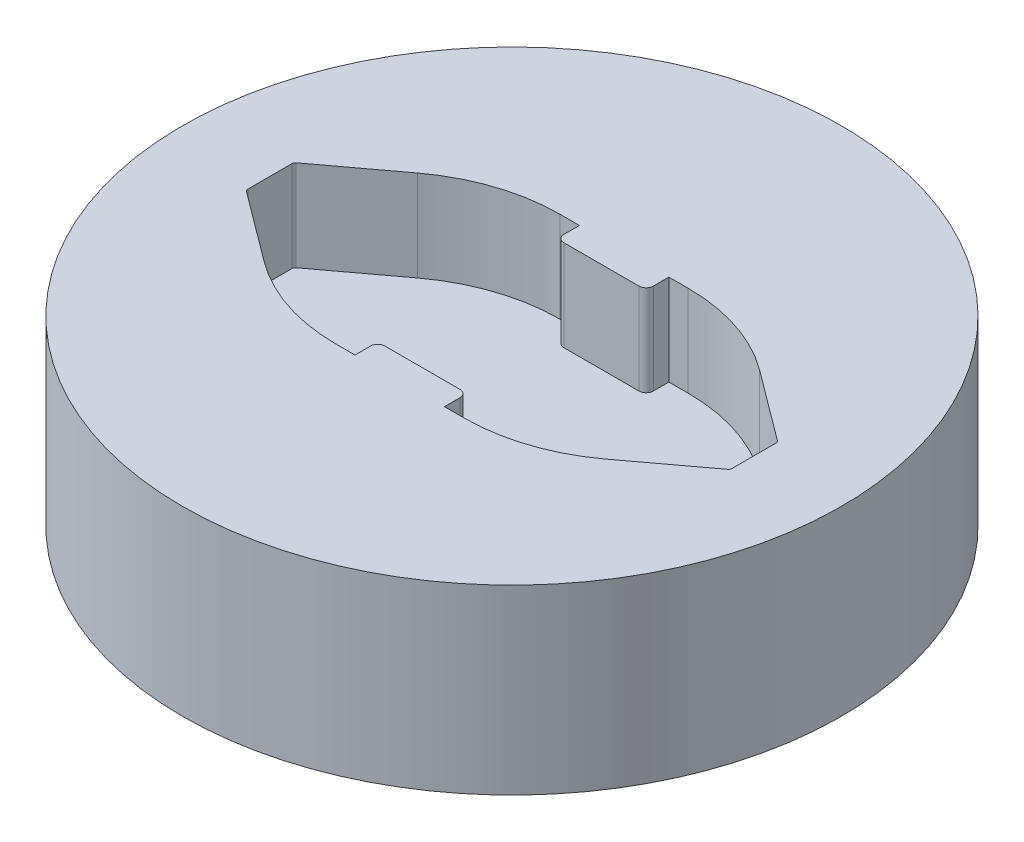
ISO-10303-21;
HEADER;
FILE_DESCRIPTION(('STEP AP214'),'2;1');
FILE_NAME('part.step','',(''),(''),'','','');
FILE_SCHEMA(('AUTOMOTIVE_DESIGN { 1 0 10303 214 1 1 1 1 }'));
ENDSEC;
DATA;
#1=APPLICATION_CONTEXT('core data for automotive mechanical design processes');
#2=APPLICATION_PROTOCOL_DEFINITION('international standard','automotive_design',2000,#1);
#3=PRODUCT_CONTEXT('',#1,'mechanical');
#4=PRODUCT('Part','Part','',(#3));
#5=PRODUCT_RELATED_PRODUCT_CATEGORY('part','',(#4));
#6=PRODUCT_DEFINITION_FORMATION('','',#4);
#7=PRODUCT_DEFINITION_CONTEXT('part definition',#1,'design');
#8=PRODUCT_DEFINITION('design','',#6,#7);
#9=PRODUCT_DEFINITION_SHAPE('','',#8);
#10=(LENGTH_UNIT() NAMED_UNIT(*) SI_UNIT(.MILLI.,.METRE.));
#11=(NAMED_UNIT(*) PLANE_ANGLE_UNIT() SI_UNIT($,.RADIAN.));
#12=(NAMED_UNIT(*) SI_UNIT($,.STERADIAN.) SOLID_ANGLE_UNIT());
#13=UNCERTAINTY_MEASURE_WITH_UNIT(LENGTH_MEASURE(1.E-05),#10,'distance_accuracy_value','');
#14=(GEOMETRIC_REPRESENTATION_CONTEXT(3) GLOBAL_UNCERTAINTY_ASSIGNED_CONTEXT((#13)) GLOBAL_UNIT_ASSIGNED_CONTEXT((#10,
#11,#12)) REPRESENTATION_CONTEXT('',''));
#15=CARTESIAN_POINT('',(0.,0.,0.));
#16=DIRECTION('',(0.,0.,1.));
#17=DIRECTION('',(1.,0.,0.));
#18=AXIS2_PLACEMENT_3D('',#15,#16,#17);
#19=CARTESIAN_POINT('',(0.,50.8,0.));
#20=DIRECTION('',(0.,-1.,0.));
#21=DIRECTION('',(0.,0.,-1.));
#22=AXIS2_PLACEMENT_3D('',#19,#20,#21);
#23=CYLINDRICAL_SURFACE('',#22,92.075);
#24=CARTESIAN_POINT('',(0.,50.8,0.));
#25=DIRECTION('',(0.,1.,0.));
#26=DIRECTION('',(0.,0.,1.));
#27=AXIS2_PLACEMENT_3D('',#24,#25,#26);
#28=CIRCLE('',#27,92.075);
#29=CARTESIAN_POINT('',(0.,50.8,92.075));
#30=VERTEX_POINT('',#29);
#31=EDGE_CURVE('E11',#30,#30,#28,.T.);
#32=ORIENTED_EDGE('',*,*,#31,.F.);
#33=EDGE_LOOP('',(#32));
#34=FACE_BOUND('',#33,.T.);
#35=CARTESIAN_POINT('',(0.,0.,0.));
#36=DIRECTION('',(0.,1.,0.));
#37=DIRECTION('',(0.,0.,1.));
#38=AXIS2_PLACEMENT_3D('',#35,#36,#37);
#39=CIRCLE('',#38,92.075);
#40=CARTESIAN_POINT('',(0.,0.,92.075));
#41=VERTEX_POINT('',#40);
#42=EDGE_CURVE('E35',#41,#41,#39,.T.);
#43=ORIENTED_EDGE('',*,*,#42,.T.);
#44=EDGE_LOOP('',(#43));
#45=FACE_BOUND('',#44,.T.);
#46=ADVANCED_FACE('F32',(#34,#45),#23,.T.);
#47=CARTESIAN_POINT('',(0.,50.8,0.));
#48=DIRECTION('',(0.,1.,0.));
#49=DIRECTION('',(0.,0.,1.));
#50=AXIS2_PLACEMENT_3D('',#47,#48,#49);
#51=PLANE('',#50);
#52=DIRECTION('',(0.,0.,-1.));
#53=VECTOR('',#52,1.);
#54=CARTESIAN_POINT('',(67.6117740544507,50.8,6.14971659310508));
#55=LINE('',#54,#53);
#56=CARTESIAN_POINT('',(67.6117740544507,50.8,6.14971659310508));
#57=VERTEX_POINT('',#56);
#58=CARTESIAN_POINT('',(67.6117740544507,50.8,-6.14971659310505));
#59=VERTEX_POINT('',#58);
#60=EDGE_CURVE('E328',#57,#59,#55,.T.);
#61=ORIENTED_EDGE('',*,*,#60,.F.);
#62=CARTESIAN_POINT('',(66.6117740544507,50.8,6.14971659310508));
#63=DIRECTION('',(0.,1.,0.));
#64=DIRECTION('',(0.,0.,1.));
#65=AXIS2_PLACEMENT_3D('',#62,#63,#64);
#66=CIRCLE('',#65,1.00000000000001);
#67=CARTESIAN_POINT('',(67.2096775734564,50.8,6.95128467003967));
#68=VERTEX_POINT('',#67);
#69=EDGE_CURVE('E326',#68,#57,#66,.T.);
#70=ORIENTED_EDGE('',*,*,#69,.F.);
#71=DIRECTION('',(0.801568076934592,0.,-0.597903519005684));
#72=VECTOR('',#71,1.);
#73=CARTESIAN_POINT('',(47.8012007721985,50.8,21.4284038467296));
#74=LINE('',#73,#72);
#75=CARTESIAN_POINT('',(47.8012007721985,50.8,21.4284038467296));
#76=VERTEX_POINT('',#75);
#77=EDGE_CURVE('E324',#76,#68,#74,.T.);
#78=ORIENTED_EDGE('',*,*,#77,.F.);
#79=CARTESIAN_POINT('',(17.9060248219143,50.8,-18.65));
#80=DIRECTION('',(0.,1.,0.));
#81=DIRECTION('',(0.,0.,1.));
#82=AXIS2_PLACEMENT_3D('',#79,#80,#81);
#83=CIRCLE('',#82,50.);
#84=CARTESIAN_POINT('',(17.9060248219143,50.8,31.35));
#85=VERTEX_POINT('',#84);
#86=EDGE_CURVE('E229',#85,#76,#83,.T.);
#87=ORIENTED_EDGE('',*,*,#86,.F.);
#88=DIRECTION('',(1.,0.,0.));
#89=VECTOR('',#88,1.);
#90=CARTESIAN_POINT('',(17.9060248219143,50.8,31.35));
#91=LINE('',#90,#89);
#92=CARTESIAN_POINT('',(12.5,50.8,31.35));
#93=VERTEX_POINT('',#92);
#94=EDGE_CURVE('E320',#93,#85,#91,.T.);
#95=ORIENTED_EDGE('',*,*,#94,.F.);
#96=DIRECTION('',(0.,0.,1.));
#97=VECTOR('',#96,1.);
#98=CARTESIAN_POINT('',(12.5,50.8,31.35));
#99=LINE('',#98,#97);
#100=CARTESIAN_POINT('',(12.5,50.8,27.));
#101=VERTEX_POINT('',#100);
#102=EDGE_CURVE('E317',#101,#93,#99,.T.);
#103=ORIENTED_EDGE('',*,*,#102,.F.);
#104=CARTESIAN_POINT('',(10.5,50.8,27.));
#105=DIRECTION('',(0.,-1.,0.));
#106=DIRECTION('',(0.,0.,1.));
#107=AXIS2_PLACEMENT_3D('',#104,#105,#106);
#108=CIRCLE('',#107,2.);
#109=CARTESIAN_POINT('',(10.5,50.8,25.));
#110=VERTEX_POINT('',#109);
#111=EDGE_CURVE('E314',#110,#101,#108,.T.);
#112=ORIENTED_EDGE('',*,*,#111,.F.);
#113=DIRECTION('',(1.,0.,0.));
#114=VECTOR('',#113,1.);
#115=CARTESIAN_POINT('',(0.667840433800816,50.8,25.));
#116=LINE('',#115,#114);
#117=CARTESIAN_POINT('',(-10.5,50.8,25.));
#118=VERTEX_POINT('',#117);
#119=EDGE_CURVE('E311',#118,#110,#116,.T.);
#120=ORIENTED_EDGE('',*,*,#119,.F.);
#121=CARTESIAN_POINT('',(-10.5,50.8,27.));
#122=DIRECTION('',(0.,-1.,0.));
#123=DIRECTION('',(0.,0.,1.));
#124=AXIS2_PLACEMENT_3D('',#121,#122,#123);
#125=CIRCLE('',#124,2.);
#126=CARTESIAN_POINT('',(-12.5,50.8,27.));
#127=VERTEX_POINT('',#126);
#128=EDGE_CURVE('E308',#127,#118,#125,.T.);
#129=ORIENTED_EDGE('',*,*,#128,.F.);
#130=DIRECTION('',(0.,0.,-1.));
#131=VECTOR('',#130,1.);
#132=CARTESIAN_POINT('',(-12.5,50.8,31.35));
#133=LINE('',#132,#131);
#134=CARTESIAN_POINT('',(-12.5,50.8,31.35));
#135=VERTEX_POINT('',#134);
#136=EDGE_CURVE('E305',#135,#127,#133,.T.);
#137=ORIENTED_EDGE('',*,*,#136,.F.);
#138=DIRECTION('',(1.,0.,0.));
#139=VECTOR('',#138,1.);
#140=CARTESIAN_POINT('',(-12.5,50.8,31.35));
#141=LINE('',#140,#139);
#142=CARTESIAN_POINT('',(-17.9060248219143,50.8,31.35));
#143=VERTEX_POINT('',#142);
#144=EDGE_CURVE('E302',#143,#135,#141,.T.);
#145=ORIENTED_EDGE('',*,*,#144,.F.);
#146=CARTESIAN_POINT('',(-17.9060248219143,50.8,-18.65));
#147=DIRECTION('',(0.,1.,0.));
#148=DIRECTION('',(0.,0.,1.));
#149=AXIS2_PLACEMENT_3D('',#146,#147,#148);
#150=CIRCLE('',#149,50.);
#151=CARTESIAN_POINT('',(-47.8012007721985,50.8,21.4284038467296));
#152=VERTEX_POINT('',#151);
#153=EDGE_CURVE('E299',#152,#143,#150,.T.);
#154=ORIENTED_EDGE('',*,*,#153,.F.);
#155=DIRECTION('',(0.801568076934592,0.,0.597903519005684));
#156=VECTOR('',#155,1.);
#157=CARTESIAN_POINT('',(-67.2096775734564,50.8,6.95128467003967));
#158=LINE('',#157,#156);
#159=CARTESIAN_POINT('',(-67.2096775734564,50.8,6.95128467003967));
#160=VERTEX_POINT('',#159);
#161=EDGE_CURVE('E296',#160,#152,#158,.T.);
#162=ORIENTED_EDGE('',*,*,#161,.F.);
#163=CARTESIAN_POINT('',(-66.6117740544507,50.8,6.14971659310508));
#164=DIRECTION('',(0.,1.,0.));
#165=DIRECTION('',(0.,0.,1.));
#166=AXIS2_PLACEMENT_3D('',#163,#164,#165);
#167=CIRCLE('',#166,1.);
#168=CARTESIAN_POINT('',(-67.6117740544507,50.8,6.14971659310508));
#169=VERTEX_POINT('',#168);
#170=EDGE_CURVE('E293',#169,#160,#167,.T.);
#171=ORIENTED_EDGE('',*,*,#170,.F.);
#172=DIRECTION('',(0.,0.,1.));
#173=VECTOR('',#172,1.);
#174=CARTESIAN_POINT('',(-67.6117740544507,50.8,4.9888258448116));
#175=LINE('',#174,#173);
#176=CARTESIAN_POINT('',(-67.6117740544507,50.8,-6.14971659310508));
#177=VERTEX_POINT('',#176);
#178=EDGE_CURVE('E290',#177,#169,#175,.T.);
#179=ORIENTED_EDGE('',*,*,#178,.F.);
#180=CARTESIAN_POINT('',(-66.6117740544507,50.8,-6.14971659310508));
#181=DIRECTION('',(0.,1.,0.));
#182=DIRECTION('',(0.,0.,1.));
#183=AXIS2_PLACEMENT_3D('',#180,#181,#182);
#184=CIRCLE('',#183,1.);
#185=CARTESIAN_POINT('',(-67.2096775734564,50.8,-6.95128467003968));
#186=VERTEX_POINT('',#185);
#187=EDGE_CURVE('E287',#186,#177,#184,.T.);
#188=ORIENTED_EDGE('',*,*,#187,.F.);
#189=DIRECTION('',(-0.801568076934592,0.,0.597903519005683));
#190=VECTOR('',#189,1.);
#191=CARTESIAN_POINT('',(-47.8012007721985,50.8,-21.4284038467296));
#192=LINE('',#191,#190);
#193=CARTESIAN_POINT('',(-47.8012007721985,50.8,-21.4284038467296));
#194=VERTEX_POINT('',#193);
#195=EDGE_CURVE('E284',#194,#186,#192,.T.);
#196=ORIENTED_EDGE('',*,*,#195,.F.);
#197=CARTESIAN_POINT('',(-17.9060248219143,50.8,18.65));
#198=DIRECTION('',(0.,1.,0.));
#199=DIRECTION('',(0.,0.,1.));
#200=AXIS2_PLACEMENT_3D('',#197,#198,#199);
#201=CIRCLE('',#200,50.);
#202=CARTESIAN_POINT('',(-17.9060248219143,50.8,-31.35));
#203=VERTEX_POINT('',#202);
#204=EDGE_CURVE('E281',#203,#194,#201,.T.);
#205=ORIENTED_EDGE('',*,*,#204,.F.);
#206=DIRECTION('',(-1.,0.,0.));
#207=VECTOR('',#206,1.);
#208=CARTESIAN_POINT('',(-17.9060248219143,50.8,-31.35));
#209=LINE('',#208,#207);
#210=CARTESIAN_POINT('',(-12.5,50.8,-31.35));
#211=VERTEX_POINT('',#210);
#212=EDGE_CURVE('E278',#211,#203,#209,.T.);
#213=ORIENTED_EDGE('',*,*,#212,.F.);
#214=DIRECTION('',(0.,0.,-1.));
#215=VECTOR('',#214,1.);
#216=CARTESIAN_POINT('',(-12.5,50.8,-31.35));
#217=LINE('',#216,#215);
#218=CARTESIAN_POINT('',(-12.5,50.8,-27.));
#219=VERTEX_POINT('',#218);
#220=EDGE_CURVE('E275',#219,#211,#217,.T.);
#221=ORIENTED_EDGE('',*,*,#220,.F.);
#222=CARTESIAN_POINT('',(-10.5,50.8,-27.));
#223=DIRECTION('',(0.,-1.,0.));
#224=DIRECTION('',(0.,0.,1.));
#225=AXIS2_PLACEMENT_3D('',#222,#223,#224);
#226=CIRCLE('',#225,2.);
#227=CARTESIAN_POINT('',(-10.5,50.8,-25.));
#228=VERTEX_POINT('',#227);
#229=EDGE_CURVE('E272',#228,#219,#226,.T.);
#230=ORIENTED_EDGE('',*,*,#229,.F.);
#231=DIRECTION('',(-1.,0.,0.));
#232=VECTOR('',#231,1.);
#233=CARTESIAN_POINT('',(-0.667840433800748,50.8,-25.));
#234=LINE('',#233,#232);
#235=CARTESIAN_POINT('',(10.5,50.8,-25.));
#236=VERTEX_POINT('',#235);
#237=EDGE_CURVE('E269',#236,#228,#234,.T.);
#238=ORIENTED_EDGE('',*,*,#237,.F.);
#239=CARTESIAN_POINT('',(10.5,50.8,-27.));
#240=DIRECTION('',(0.,-1.,0.));
#241=DIRECTION('',(0.,0.,1.));
#242=AXIS2_PLACEMENT_3D('',#239,#240,#241);
#243=CIRCLE('',#242,2.);
#244=CARTESIAN_POINT('',(12.5,50.8,-27.));
#245=VERTEX_POINT('',#244);
#246=EDGE_CURVE('E266',#245,#236,#243,.T.);
#247=ORIENTED_EDGE('',*,*,#246,.F.);
#248=DIRECTION('',(0.,0.,1.));
#249=VECTOR('',#248,1.);
#250=CARTESIAN_POINT('',(12.5,50.8,-31.35));
#251=LINE('',#250,#249);
#252=CARTESIAN_POINT('',(12.5,50.8,-31.35));
#253=VERTEX_POINT('',#252);
#254=EDGE_CURVE('E263',#253,#245,#251,.T.);
#255=ORIENTED_EDGE('',*,*,#254,.F.);
#256=DIRECTION('',(-1.,0.,0.));
#257=VECTOR('',#256,1.);
#258=CARTESIAN_POINT('',(12.5,50.8,-31.35));
#259=LINE('',#258,#257);
#260=CARTESIAN_POINT('',(17.9060248219143,50.8,-31.35));
#261=VERTEX_POINT('',#260);
#262=EDGE_CURVE('E260',#261,#253,#259,.T.);
#263=ORIENTED_EDGE('',*,*,#262,.F.);
#264=CARTESIAN_POINT('',(17.9060248219143,50.8,18.65));
#265=DIRECTION('',(0.,1.,0.));
#266=DIRECTION('',(0.,0.,1.));
#267=AXIS2_PLACEMENT_3D('',#264,#265,#266);
#268=CIRCLE('',#267,50.);
#269=CARTESIAN_POINT('',(47.8012007721985,50.8,-21.4284038467296));
#270=VERTEX_POINT('',#269);
#271=EDGE_CURVE('E257',#270,#261,#268,.T.);
#272=ORIENTED_EDGE('',*,*,#271,.F.);
#273=DIRECTION('',(-0.801568076934592,0.,-0.597903519005684));
#274=VECTOR('',#273,1.);
#275=CARTESIAN_POINT('',(67.2096775734564,50.8,-6.95128467003965));
#276=LINE('',#275,#274);
#277=CARTESIAN_POINT('',(67.2096775734564,50.8,-6.95128467003965));
#278=VERTEX_POINT('',#277);
#279=EDGE_CURVE('E254',#278,#270,#276,.T.);
#280=ORIENTED_EDGE('',*,*,#279,.F.);
#281=CARTESIAN_POINT('',(66.6117740544507,50.8,-6.14971659310505));
#282=DIRECTION('',(0.,1.,0.));
#283=DIRECTION('',(0.,0.,1.));
#284=AXIS2_PLACEMENT_3D('',#281,#282,#283);
#285=CIRCLE('',#284,0.999999999999999);
#286=EDGE_CURVE('E252',#59,#278,#285,.T.);
#287=ORIENTED_EDGE('',*,*,#286,.F.);
#288=EDGE_LOOP('',(#61,#70,#78,#87,#95,#103,#112,#120,#129,#137,#145,#154,#162,#171,#179,#188,
#196,#205,#213,#221,#230,#238,#247,#255,#263,#272,#280,#287));
#289=FACE_BOUND('',#288,.T.);
#290=ORIENTED_EDGE('',*,*,#31,.T.);
#291=EDGE_LOOP('',(#290));
#292=FACE_BOUND('',#291,.T.);
#293=ADVANCED_FACE('F390',(#289,#292),#51,.T.);
#294=CARTESIAN_POINT('',(0.,0.,0.));
#295=DIRECTION('',(0.,1.,0.));
#296=DIRECTION('',(0.,0.,1.));
#297=AXIS2_PLACEMENT_3D('',#294,#295,#296);
#298=PLANE('',#297);
#299=ORIENTED_EDGE('',*,*,#42,.F.);
#300=EDGE_LOOP('',(#299));
#301=FACE_BOUND('',#300,.T.);
#302=ADVANCED_FACE('F478',(#301),#298,.F.);
#303=CARTESIAN_POINT('',(67.6117740544507,25.4,6.14971659310508));
#304=DIRECTION('',(1.,0.,0.));
#305=DIRECTION('',(0.,0.,-1.));
#306=AXIS2_PLACEMENT_3D('',#303,#304,#305);
#307=PLANE('',#306);
#308=ORIENTED_EDGE('',*,*,#60,.T.);
#309=DIRECTION('',(0.,1.,0.));
#310=VECTOR('',#309,1.);
#311=CARTESIAN_POINT('',(67.6117740544507,25.4,-6.14971659310505));
#312=LINE('',#311,#310);
#313=CARTESIAN_POINT('',(67.6117740544507,25.4,-6.14971659310505));
#314=VERTEX_POINT('',#313);
#315=EDGE_CURVE('E46',#314,#59,#312,.T.);
#316=ORIENTED_EDGE('',*,*,#315,.F.);
#317=DIRECTION('',(0.,0.,-1.));
#318=VECTOR('',#317,1.);
#319=CARTESIAN_POINT('',(67.6117740544507,25.4,4.98882584481154));
#320=LINE('',#319,#318);
#321=CARTESIAN_POINT('',(67.6117740544507,25.4,6.14971659310508));
#322=VERTEX_POINT('',#321);
#323=EDGE_CURVE('E54',#322,#314,#320,.T.);
#324=ORIENTED_EDGE('',*,*,#323,.F.);
#325=DIRECTION('',(0.,1.,0.));
#326=VECTOR('',#325,1.);
#327=CARTESIAN_POINT('',(67.6117740544507,25.4,6.14971659310508));
#328=LINE('',#327,#326);
#329=EDGE_CURVE('E140',#322,#57,#328,.T.);
#330=ORIENTED_EDGE('',*,*,#329,.T.);
#331=EDGE_LOOP('',(#308,#316,#324,#330));
#332=FACE_BOUND('',#331,.T.);
#333=ADVANCED_FACE('F471',(#332),#307,.F.);
#334=CARTESIAN_POINT('',(66.6117740544507,25.4,6.14971659310508));
#335=DIRECTION('',(0.,1.,0.));
#336=DIRECTION('',(0.,0.,1.));
#337=AXIS2_PLACEMENT_3D('',#334,#335,#336);
#338=CYLINDRICAL_SURFACE('',#337,1.00000000000001);
#339=ORIENTED_EDGE('',*,*,#69,.T.);
#340=ORIENTED_EDGE('',*,*,#329,.F.);
#341=CARTESIAN_POINT('',(66.6117740544507,25.4,6.14971659310508));
#342=DIRECTION('',(0.,1.,0.));
#343=DIRECTION('',(0.,0.,1.));
#344=AXIS2_PLACEMENT_3D('',#341,#342,#343);
#345=CIRCLE('',#344,1.00000000000001);
#346=CARTESIAN_POINT('',(67.2096775734564,25.4,6.95128467003967));
#347=VERTEX_POINT('',#346);
#348=EDGE_CURVE('E240',#347,#322,#345,.T.);
#349=ORIENTED_EDGE('',*,*,#348,.F.);
#350=DIRECTION('',(0.,1.,0.));
#351=VECTOR('',#350,1.);
#352=CARTESIAN_POINT('',(67.2096775734564,25.4,6.95128467003967));
#353=LINE('',#352,#351);
#354=EDGE_CURVE('E233',#347,#68,#353,.T.);
#355=ORIENTED_EDGE('',*,*,#354,.T.);
#356=EDGE_LOOP('',(#339,#340,#349,#355));
#357=FACE_BOUND('',#356,.T.);
#358=ADVANCED_FACE('F469',(#357),#338,.F.);
#359=CARTESIAN_POINT('',(47.8012007721985,25.4,21.4284038467296));
#360=DIRECTION('',(0.597903519005684,0.,0.801568076934592));
#361=DIRECTION('',(0.801568076934592,0.,-0.597903519005684));
#362=AXIS2_PLACEMENT_3D('',#359,#360,#361);
#363=PLANE('',#362);
#364=ORIENTED_EDGE('',*,*,#77,.T.);
#365=ORIENTED_EDGE('',*,*,#354,.F.);
#366=DIRECTION('',(0.801568076934592,0.,-0.597903519005684));
#367=VECTOR('',#366,1.);
#368=CARTESIAN_POINT('',(47.8012007721985,25.4,21.4284038467296));
#369=LINE('',#368,#367);
#370=CARTESIAN_POINT('',(47.8012007721985,25.4,21.4284038467296));
#371=VERTEX_POINT('',#370);
#372=EDGE_CURVE('E237',#371,#347,#369,.T.);
#373=ORIENTED_EDGE('',*,*,#372,.F.);
#374=DIRECTION('',(0.,1.,0.));
#375=VECTOR('',#374,1.);
#376=CARTESIAN_POINT('',(47.8012007721985,25.4,21.4284038467296));
#377=LINE('',#376,#375);
#378=EDGE_CURVE('E222',#371,#76,#377,.T.);
#379=ORIENTED_EDGE('',*,*,#378,.T.);
#380=EDGE_LOOP('',(#364,#365,#373,#379));
#381=FACE_BOUND('',#380,.T.);
#382=ADVANCED_FACE('F238',(#381),#363,.F.);
#383=CARTESIAN_POINT('',(17.9060248219143,25.4,-18.65));
#384=DIRECTION('',(0.,1.,0.));
#385=DIRECTION('',(0.,0.,1.));
#386=AXIS2_PLACEMENT_3D('',#383,#384,#385);
#387=CYLINDRICAL_SURFACE('',#386,50.);
#388=ORIENTED_EDGE('',*,*,#86,.T.);
#389=ORIENTED_EDGE('',*,*,#378,.F.);
#390=CARTESIAN_POINT('',(17.9060248219143,25.4,-18.65));
#391=DIRECTION('',(0.,1.,0.));
#392=DIRECTION('',(0.,0.,1.));
#393=AXIS2_PLACEMENT_3D('',#390,#391,#392);
#394=CIRCLE('',#393,50.);
#395=CARTESIAN_POINT('',(17.9060248219143,25.4,31.35));
#396=VERTEX_POINT('',#395);
#397=EDGE_CURVE('E226',#396,#371,#394,.T.);
#398=ORIENTED_EDGE('',*,*,#397,.F.);
#399=DIRECTION('',(0.,1.,0.));
#400=VECTOR('',#399,1.);
#401=CARTESIAN_POINT('',(17.9060248219143,25.4,31.35));
#402=LINE('',#401,#400);
#403=EDGE_CURVE('E234',#396,#85,#402,.T.);
#404=ORIENTED_EDGE('',*,*,#403,.T.);
#405=EDGE_LOOP('',(#388,#389,#398,#404));
#406=FACE_BOUND('',#405,.T.);
#407=ADVANCED_FACE('F224',(#406),#387,.F.);
#408=CARTESIAN_POINT('',(17.9060248219143,25.4,31.35));
#409=DIRECTION('',(0.,0.,1.));
#410=DIRECTION('',(1.,0.,0.));
#411=AXIS2_PLACEMENT_3D('',#408,#409,#410);
#412=PLANE('',#411);
#413=ORIENTED_EDGE('',*,*,#94,.T.);
#414=ORIENTED_EDGE('',*,*,#403,.F.);
#415=DIRECTION('',(1.,0.,0.));
#416=VECTOR('',#415,1.);
#417=CARTESIAN_POINT('',(17.9060248219143,25.4,31.35));
#418=LINE('',#417,#416);
#419=CARTESIAN_POINT('',(12.5,25.4,31.35));
#420=VERTEX_POINT('',#419);
#421=EDGE_CURVE('E245',#420,#396,#418,.T.);
#422=ORIENTED_EDGE('',*,*,#421,.F.);
#423=DIRECTION('',(0.,1.,0.));
#424=VECTOR('',#423,1.);
#425=CARTESIAN_POINT('',(12.5,25.4,31.35));
#426=LINE('',#425,#424);
#427=EDGE_CURVE('E333',#420,#93,#426,.T.);
#428=ORIENTED_EDGE('',*,*,#427,.T.);
#429=EDGE_LOOP('',(#413,#414,#422,#428));
#430=FACE_BOUND('',#429,.T.);
#431=ADVANCED_FACE('F466',(#430),#412,.F.);
#432=CARTESIAN_POINT('',(12.5,25.4,31.35));
#433=DIRECTION('',(-1.,0.,0.));
#434=DIRECTION('',(0.,0.,1.));
#435=AXIS2_PLACEMENT_3D('',#432,#433,#434);
#436=PLANE('',#435);
#437=ORIENTED_EDGE('',*,*,#102,.T.);
#438=ORIENTED_EDGE('',*,*,#427,.F.);
#439=DIRECTION('',(0.,0.,1.));
#440=VECTOR('',#439,1.);
#441=CARTESIAN_POINT('',(12.5,25.4,31.35));
#442=LINE('',#441,#440);
#443=CARTESIAN_POINT('',(12.5,25.4,27.));
#444=VERTEX_POINT('',#443);
#445=EDGE_CURVE('E247',#444,#420,#442,.T.);
#446=ORIENTED_EDGE('',*,*,#445,.F.);
#447=DIRECTION('',(0.,1.,0.));
#448=VECTOR('',#447,1.);
#449=CARTESIAN_POINT('',(12.5,25.4,27.));
#450=LINE('',#449,#448);
#451=EDGE_CURVE('E335',#444,#101,#450,.T.);
#452=ORIENTED_EDGE('',*,*,#451,.T.);
#453=EDGE_LOOP('',(#437,#438,#446,#452));
#454=FACE_BOUND('',#453,.T.);
#455=ADVANCED_FACE('F462',(#454),#436,.F.);
#456=CARTESIAN_POINT('',(10.5,25.4,27.));
#457=DIRECTION('',(0.,1.,0.));
#458=DIRECTION('',(0.,0.,1.));
#459=AXIS2_PLACEMENT_3D('',#456,#457,#458);
#460=CYLINDRICAL_SURFACE('',#459,2.);
#461=ORIENTED_EDGE('',*,*,#111,.T.);
#462=ORIENTED_EDGE('',*,*,#451,.F.);
#463=CARTESIAN_POINT('',(10.5,25.4,27.));
#464=DIRECTION('',(0.,-1.,0.));
#465=DIRECTION('',(0.,0.,1.));
#466=AXIS2_PLACEMENT_3D('',#463,#464,#465);
#467=CIRCLE('',#466,2.);
#468=CARTESIAN_POINT('',(10.5,25.4,25.));
#469=VERTEX_POINT('',#468);
#470=EDGE_CURVE('E457',#469,#444,#467,.T.);
#471=ORIENTED_EDGE('',*,*,#470,.F.);
#472=DIRECTION('',(0.,1.,0.));
#473=VECTOR('',#472,1.);
#474=CARTESIAN_POINT('',(10.5,25.4,25.));
#475=LINE('',#474,#473);
#476=EDGE_CURVE('E337',#469,#110,#475,.T.);
#477=ORIENTED_EDGE('',*,*,#476,.T.);
#478=EDGE_LOOP('',(#461,#462,#471,#477));
#479=FACE_BOUND('',#478,.T.);
#480=ADVANCED_FACE('F572',(#479),#460,.T.);
#481=CARTESIAN_POINT('',(0.667840433800816,25.4,25.));
#482=DIRECTION('',(0.,0.,1.));
#483=DIRECTION('',(1.,0.,0.));
#484=AXIS2_PLACEMENT_3D('',#481,#482,#483);
#485=PLANE('',#484);
#486=ORIENTED_EDGE('',*,*,#119,.T.);
#487=ORIENTED_EDGE('',*,*,#476,.F.);
#488=DIRECTION('',(1.,0.,0.));
#489=VECTOR('',#488,1.);
#490=CARTESIAN_POINT('',(-10.5,25.4,25.));
#491=LINE('',#490,#489);
#492=CARTESIAN_POINT('',(-10.5,25.4,25.));
#493=VERTEX_POINT('',#492);
#494=EDGE_CURVE('E455',#493,#469,#491,.T.);
#495=ORIENTED_EDGE('',*,*,#494,.F.);
#496=DIRECTION('',(0.,1.,0.));
#497=VECTOR('',#496,1.);
#498=CARTESIAN_POINT('',(-10.5,25.4,25.));
#499=LINE('',#498,#497);
#500=EDGE_CURVE('E339',#493,#118,#499,.T.);
#501=ORIENTED_EDGE('',*,*,#500,.T.);
#502=EDGE_LOOP('',(#486,#487,#495,#501));
#503=FACE_BOUND('',#502,.T.);
#504=ADVANCED_FACE('F568',(#503),#485,.F.);
#505=CARTESIAN_POINT('',(-10.5,25.4,27.));
#506=DIRECTION('',(0.,1.,0.));
#507=DIRECTION('',(0.,0.,1.));
#508=AXIS2_PLACEMENT_3D('',#505,#506,#507);
#509=CYLINDRICAL_SURFACE('',#508,2.);
#510=ORIENTED_EDGE('',*,*,#128,.T.);
#511=ORIENTED_EDGE('',*,*,#500,.F.);
#512=CARTESIAN_POINT('',(-10.5,25.4,27.));
#513=DIRECTION('',(0.,-1.,0.));
#514=DIRECTION('',(0.,0.,1.));
#515=AXIS2_PLACEMENT_3D('',#512,#513,#514);
#516=CIRCLE('',#515,2.);
#517=CARTESIAN_POINT('',(-12.5,25.4,27.));
#518=VERTEX_POINT('',#517);
#519=EDGE_CURVE('E452',#518,#493,#516,.T.);
#520=ORIENTED_EDGE('',*,*,#519,.F.);
#521=DIRECTION('',(0.,1.,0.));
#522=VECTOR('',#521,1.);
#523=CARTESIAN_POINT('',(-12.5,25.4,27.));
#524=LINE('',#523,#522);
#525=EDGE_CURVE('E341',#518,#127,#524,.T.);
#526=ORIENTED_EDGE('',*,*,#525,.T.);
#527=EDGE_LOOP('',(#510,#511,#520,#526));
#528=FACE_BOUND('',#527,.T.);
#529=ADVANCED_FACE('F564',(#528),#509,.T.);
#530=CARTESIAN_POINT('',(-12.5,25.4,31.35));
#531=DIRECTION('',(1.,0.,0.));
#532=DIRECTION('',(0.,0.,-1.));
#533=AXIS2_PLACEMENT_3D('',#530,#531,#532);
#534=PLANE('',#533);
#535=ORIENTED_EDGE('',*,*,#136,.T.);
#536=ORIENTED_EDGE('',*,*,#525,.F.);
#537=DIRECTION('',(0.,0.,-1.));
#538=VECTOR('',#537,1.);
#539=CARTESIAN_POINT('',(-12.5,25.4,31.35));
#540=LINE('',#539,#538);
#541=CARTESIAN_POINT('',(-12.5,25.4,31.35));
#542=VERTEX_POINT('',#541);
#543=EDGE_CURVE('E449',#542,#518,#540,.T.);
#544=ORIENTED_EDGE('',*,*,#543,.F.);
#545=DIRECTION('',(0.,1.,0.));
#546=VECTOR('',#545,1.);
#547=CARTESIAN_POINT('',(-12.5,25.4,31.35));
#548=LINE('',#547,#546);
#549=EDGE_CURVE('E343',#542,#135,#548,.T.);
#550=ORIENTED_EDGE('',*,*,#549,.T.);
#551=EDGE_LOOP('',(#535,#536,#544,#550));
#552=FACE_BOUND('',#551,.T.);
#553=ADVANCED_FACE('F560',(#552),#534,.F.);
#554=CARTESIAN_POINT('',(-12.5,25.4,31.35));
#555=DIRECTION('',(0.,0.,1.));
#556=DIRECTION('',(1.,0.,0.));
#557=AXIS2_PLACEMENT_3D('',#554,#555,#556);
#558=PLANE('',#557);
#559=ORIENTED_EDGE('',*,*,#144,.T.);
#560=ORIENTED_EDGE('',*,*,#549,.F.);
#561=DIRECTION('',(1.,0.,0.));
#562=VECTOR('',#561,1.);
#563=CARTESIAN_POINT('',(-12.5,25.4,31.35));
#564=LINE('',#563,#562);
#565=CARTESIAN_POINT('',(-17.9060248219143,25.4,31.35));
#566=VERTEX_POINT('',#565);
#567=EDGE_CURVE('E446',#566,#542,#564,.T.);
#568=ORIENTED_EDGE('',*,*,#567,.F.);
#569=DIRECTION('',(0.,1.,0.));
#570=VECTOR('',#569,1.);
#571=CARTESIAN_POINT('',(-17.9060248219143,25.4,31.35));
#572=LINE('',#571,#570);
#573=EDGE_CURVE('E345',#566,#143,#572,.T.);
#574=ORIENTED_EDGE('',*,*,#573,.T.);
#575=EDGE_LOOP('',(#559,#560,#568,#574));
#576=FACE_BOUND('',#575,.T.);
#577=ADVANCED_FACE('F556',(#576),#558,.F.);
#578=CARTESIAN_POINT('',(-17.9060248219143,25.4,-18.65));
#579=DIRECTION('',(0.,1.,0.));
#580=DIRECTION('',(0.,0.,1.));
#581=AXIS2_PLACEMENT_3D('',#578,#579,#580);
#582=CYLINDRICAL_SURFACE('',#581,50.);
#583=ORIENTED_EDGE('',*,*,#153,.T.);
#584=ORIENTED_EDGE('',*,*,#573,.F.);
#585=CARTESIAN_POINT('',(-17.9060248219143,25.4,-18.65));
#586=DIRECTION('',(0.,1.,0.));
#587=DIRECTION('',(0.,0.,1.));
#588=AXIS2_PLACEMENT_3D('',#585,#586,#587);
#589=CIRCLE('',#588,50.);
#590=CARTESIAN_POINT('',(-47.8012007721985,25.4,21.4284038467296));
#591=VERTEX_POINT('',#590);
#592=EDGE_CURVE('E443',#591,#566,#589,.T.);
#593=ORIENTED_EDGE('',*,*,#592,.F.);
#594=DIRECTION('',(0.,1.,0.));
#595=VECTOR('',#594,1.);
#596=CARTESIAN_POINT('',(-47.8012007721985,25.4,21.4284038467296));
#597=LINE('',#596,#595);
#598=EDGE_CURVE('E347',#591,#152,#597,.T.);
#599=ORIENTED_EDGE('',*,*,#598,.T.);
#600=EDGE_LOOP('',(#583,#584,#593,#599));
#601=FACE_BOUND('',#600,.T.);
#602=ADVANCED_FACE('F552',(#601),#582,.F.);
#603=CARTESIAN_POINT('',(-67.2096775734564,25.4,6.95128467003967));
#604=DIRECTION('',(-0.597903519005684,0.,0.801568076934592));
#605=DIRECTION('',(0.801568076934592,0.,0.597903519005684));
#606=AXIS2_PLACEMENT_3D('',#603,#604,#605);
#607=PLANE('',#606);
#608=ORIENTED_EDGE('',*,*,#161,.T.);
#609=ORIENTED_EDGE('',*,*,#598,.F.);
#610=DIRECTION('',(0.801568076934592,0.,0.597903519005684));
#611=VECTOR('',#610,1.);
#612=CARTESIAN_POINT('',(-67.2096775734564,25.4,6.95128467003967));
#613=LINE('',#612,#611);
#614=CARTESIAN_POINT('',(-67.2096775734564,25.4,6.95128467003967));
#615=VERTEX_POINT('',#614);
#616=EDGE_CURVE('E440',#615,#591,#613,.T.);
#617=ORIENTED_EDGE('',*,*,#616,.F.);
#618=DIRECTION('',(0.,1.,0.));
#619=VECTOR('',#618,1.);
#620=CARTESIAN_POINT('',(-67.2096775734564,25.4,6.95128467003967));
#621=LINE('',#620,#619);
#622=EDGE_CURVE('E349',#615,#160,#621,.T.);
#623=ORIENTED_EDGE('',*,*,#622,.T.);
#624=EDGE_LOOP('',(#608,#609,#617,#623));
#625=FACE_BOUND('',#624,.T.);
#626=ADVANCED_FACE('F548',(#625),#607,.F.);
#627=CARTESIAN_POINT('',(-66.6117740544507,25.4,6.14971659310508));
#628=DIRECTION('',(0.,1.,0.));
#629=DIRECTION('',(0.,0.,1.));
#630=AXIS2_PLACEMENT_3D('',#627,#628,#629);
#631=CYLINDRICAL_SURFACE('',#630,1.);
#632=ORIENTED_EDGE('',*,*,#170,.T.);
#633=ORIENTED_EDGE('',*,*,#622,.F.);
#634=CARTESIAN_POINT('',(-66.6117740544507,25.4,6.14971659310508));
#635=DIRECTION('',(0.,1.,0.));
#636=DIRECTION('',(0.,0.,1.));
#637=AXIS2_PLACEMENT_3D('',#634,#635,#636);
#638=CIRCLE('',#637,1.);
#639=CARTESIAN_POINT('',(-67.6117740544507,25.4,6.14971659310508));
#640=VERTEX_POINT('',#639);
#641=EDGE_CURVE('E437',#640,#615,#638,.T.);
#642=ORIENTED_EDGE('',*,*,#641,.F.);
#643=DIRECTION('',(0.,1.,0.));
#644=VECTOR('',#643,1.);
#645=CARTESIAN_POINT('',(-67.6117740544507,25.4,6.14971659310508));
#646=LINE('',#645,#644);
#647=EDGE_CURVE('E351',#640,#169,#646,.T.);
#648=ORIENTED_EDGE('',*,*,#647,.T.);
#649=EDGE_LOOP('',(#632,#633,#642,#648));
#650=FACE_BOUND('',#649,.T.);
#651=ADVANCED_FACE('F544',(#650),#631,.F.);
#652=CARTESIAN_POINT('',(-67.6117740544507,25.4,4.9888258448116));
#653=DIRECTION('',(-1.,0.,0.));
#654=DIRECTION('',(0.,0.,1.));
#655=AXIS2_PLACEMENT_3D('',#652,#653,#654);
#656=PLANE('',#655);
#657=ORIENTED_EDGE('',*,*,#178,.T.);
#658=ORIENTED_EDGE('',*,*,#647,.F.);
#659=DIRECTION('',(0.,0.,1.));
#660=VECTOR('',#659,1.);
#661=CARTESIAN_POINT('',(-67.6117740544507,25.4,-6.14971659310508));
#662=LINE('',#661,#660);
#663=CARTESIAN_POINT('',(-67.6117740544507,25.4,-6.14971659310508));
#664=VERTEX_POINT('',#663);
#665=EDGE_CURVE('E435',#664,#640,#662,.T.);
#666=ORIENTED_EDGE('',*,*,#665,.F.);
#667=DIRECTION('',(0.,1.,0.));
#668=VECTOR('',#667,1.);
#669=CARTESIAN_POINT('',(-67.6117740544507,25.4,-6.14971659310508));
#670=LINE('',#669,#668);
#671=EDGE_CURVE('E353',#664,#177,#670,.T.);
#672=ORIENTED_EDGE('',*,*,#671,.T.);
#673=EDGE_LOOP('',(#657,#658,#666,#672));
#674=FACE_BOUND('',#673,.T.);
#675=ADVANCED_FACE('F540',(#674),#656,.F.);
#676=CARTESIAN_POINT('',(-66.6117740544507,25.4,-6.14971659310508));
#677=DIRECTION('',(0.,1.,0.));
#678=DIRECTION('',(0.,0.,1.));
#679=AXIS2_PLACEMENT_3D('',#676,#677,#678);
#680=CYLINDRICAL_SURFACE('',#679,1.);
#681=ORIENTED_EDGE('',*,*,#187,.T.);
#682=ORIENTED_EDGE('',*,*,#671,.F.);
#683=CARTESIAN_POINT('',(-66.6117740544507,25.4,-6.14971659310508));
#684=DIRECTION('',(0.,1.,0.));
#685=DIRECTION('',(0.,0.,1.));
#686=AXIS2_PLACEMENT_3D('',#683,#684,#685);
#687=CIRCLE('',#686,1.);
#688=CARTESIAN_POINT('',(-67.2096775734564,25.4,-6.95128467003968));
#689=VERTEX_POINT('',#688);
#690=EDGE_CURVE('E432',#689,#664,#687,.T.);
#691=ORIENTED_EDGE('',*,*,#690,.F.);
#692=DIRECTION('',(0.,1.,0.));
#693=VECTOR('',#692,1.);
#694=CARTESIAN_POINT('',(-67.2096775734564,25.4,-6.95128467003968));
#695=LINE('',#694,#693);
#696=EDGE_CURVE('E355',#689,#186,#695,.T.);
#697=ORIENTED_EDGE('',*,*,#696,.T.);
#698=EDGE_LOOP('',(#681,#682,#691,#697));
#699=FACE_BOUND('',#698,.T.);
#700=ADVANCED_FACE('F536',(#699),#680,.F.);
#701=CARTESIAN_POINT('',(-47.8012007721985,25.4,-21.4284038467296));
#702=DIRECTION('',(-0.597903519005683,0.,-0.801568076934592));
#703=DIRECTION('',(-0.801568076934592,0.,0.597903519005683));
#704=AXIS2_PLACEMENT_3D('',#701,#702,#703);
#705=PLANE('',#704);
#706=ORIENTED_EDGE('',*,*,#195,.T.);
#707=ORIENTED_EDGE('',*,*,#696,.F.);
#708=DIRECTION('',(-0.801568076934592,0.,0.597903519005683));
#709=VECTOR('',#708,1.);
#710=CARTESIAN_POINT('',(-47.8012007721985,25.4,-21.4284038467296));
#711=LINE('',#710,#709);
#712=CARTESIAN_POINT('',(-47.8012007721985,25.4,-21.4284038467296));
#713=VERTEX_POINT('',#712);
#714=EDGE_CURVE('E429',#713,#689,#711,.T.);
#715=ORIENTED_EDGE('',*,*,#714,.F.);
#716=DIRECTION('',(0.,1.,0.));
#717=VECTOR('',#716,1.);
#718=CARTESIAN_POINT('',(-47.8012007721985,25.4,-21.4284038467296));
#719=LINE('',#718,#717);
#720=EDGE_CURVE('E357',#713,#194,#719,.T.);
#721=ORIENTED_EDGE('',*,*,#720,.T.);
#722=EDGE_LOOP('',(#706,#707,#715,#721));
#723=FACE_BOUND('',#722,.T.);
#724=ADVANCED_FACE('F532',(#723),#705,.F.);
#725=CARTESIAN_POINT('',(-17.9060248219143,25.4,18.65));
#726=DIRECTION('',(0.,1.,0.));
#727=DIRECTION('',(0.,0.,1.));
#728=AXIS2_PLACEMENT_3D('',#725,#726,#727);
#729=CYLINDRICAL_SURFACE('',#728,50.);
#730=ORIENTED_EDGE('',*,*,#204,.T.);
#731=ORIENTED_EDGE('',*,*,#720,.F.);
#732=CARTESIAN_POINT('',(-17.9060248219143,25.4,18.65));
#733=DIRECTION('',(0.,1.,0.));
#734=DIRECTION('',(0.,0.,1.));
#735=AXIS2_PLACEMENT_3D('',#732,#733,#734);
#736=CIRCLE('',#735,50.);
#737=CARTESIAN_POINT('',(-17.9060248219143,25.4,-31.35));
#738=VERTEX_POINT('',#737);
#739=EDGE_CURVE('E426',#738,#713,#736,.T.);
#740=ORIENTED_EDGE('',*,*,#739,.F.);
#741=DIRECTION('',(0.,1.,0.));
#742=VECTOR('',#741,1.);
#743=CARTESIAN_POINT('',(-17.9060248219143,25.4,-31.35));
#744=LINE('',#743,#742);
#745=EDGE_CURVE('E359',#738,#203,#744,.T.);
#746=ORIENTED_EDGE('',*,*,#745,.T.);
#747=EDGE_LOOP('',(#730,#731,#740,#746));
#748=FACE_BOUND('',#747,.T.);
#749=ADVANCED_FACE('F528',(#748),#729,.F.);
#750=CARTESIAN_POINT('',(-17.9060248219143,25.4,-31.35));
#751=DIRECTION('',(0.,0.,-1.));
#752=DIRECTION('',(-1.,0.,0.));
#753=AXIS2_PLACEMENT_3D('',#750,#751,#752);
#754=PLANE('',#753);
#755=ORIENTED_EDGE('',*,*,#212,.T.);
#756=ORIENTED_EDGE('',*,*,#745,.F.);
#757=DIRECTION('',(-1.,0.,0.));
#758=VECTOR('',#757,1.);
#759=CARTESIAN_POINT('',(-17.9060248219143,25.4,-31.35));
#760=LINE('',#759,#758);
#761=CARTESIAN_POINT('',(-12.5,25.4,-31.35));
#762=VERTEX_POINT('',#761);
#763=EDGE_CURVE('E423',#762,#738,#760,.T.);
#764=ORIENTED_EDGE('',*,*,#763,.F.);
#765=DIRECTION('',(0.,1.,0.));
#766=VECTOR('',#765,1.);
#767=CARTESIAN_POINT('',(-12.5,25.4,-31.35));
#768=LINE('',#767,#766);
#769=EDGE_CURVE('E361',#762,#211,#768,.T.);
#770=ORIENTED_EDGE('',*,*,#769,.T.);
#771=EDGE_LOOP('',(#755,#756,#764,#770));
#772=FACE_BOUND('',#771,.T.);
#773=ADVANCED_FACE('F524',(#772),#754,.F.);
#774=CARTESIAN_POINT('',(-12.5,25.4,-31.35));
#775=DIRECTION('',(1.,0.,0.));
#776=DIRECTION('',(0.,0.,-1.));
#777=AXIS2_PLACEMENT_3D('',#774,#775,#776);
#778=PLANE('',#777);
#779=ORIENTED_EDGE('',*,*,#220,.T.);
#780=ORIENTED_EDGE('',*,*,#769,.F.);
#781=DIRECTION('',(0.,0.,-1.));
#782=VECTOR('',#781,1.);
#783=CARTESIAN_POINT('',(-12.5,25.4,-31.35));
#784=LINE('',#783,#782);
#785=CARTESIAN_POINT('',(-12.5,25.4,-27.));
#786=VERTEX_POINT('',#785);
#787=EDGE_CURVE('E420',#786,#762,#784,.T.);
#788=ORIENTED_EDGE('',*,*,#787,.F.);
#789=DIRECTION('',(0.,1.,0.));
#790=VECTOR('',#789,1.);
#791=CARTESIAN_POINT('',(-12.5,25.4,-27.));
#792=LINE('',#791,#790);
#793=EDGE_CURVE('E363',#786,#219,#792,.T.);
#794=ORIENTED_EDGE('',*,*,#793,.T.);
#795=EDGE_LOOP('',(#779,#780,#788,#794));
#796=FACE_BOUND('',#795,.T.);
#797=ADVANCED_FACE('F520',(#796),#778,.F.);
#798=CARTESIAN_POINT('',(-10.5,25.4,-27.));
#799=DIRECTION('',(0.,1.,0.));
#800=DIRECTION('',(0.,0.,1.));
#801=AXIS2_PLACEMENT_3D('',#798,#799,#800);
#802=CYLINDRICAL_SURFACE('',#801,2.);
#803=ORIENTED_EDGE('',*,*,#229,.T.);
#804=ORIENTED_EDGE('',*,*,#793,.F.);
#805=CARTESIAN_POINT('',(-10.5,25.4,-27.));
#806=DIRECTION('',(0.,-1.,0.));
#807=DIRECTION('',(0.,0.,1.));
#808=AXIS2_PLACEMENT_3D('',#805,#806,#807);
#809=CIRCLE('',#808,2.);
#810=CARTESIAN_POINT('',(-10.5,25.4,-25.));
#811=VERTEX_POINT('',#810);
#812=EDGE_CURVE('E417',#811,#786,#809,.T.);
#813=ORIENTED_EDGE('',*,*,#812,.F.);
#814=DIRECTION('',(0.,1.,0.));
#815=VECTOR('',#814,1.);
#816=CARTESIAN_POINT('',(-10.5,25.4,-25.));
#817=LINE('',#816,#815);
#818=EDGE_CURVE('E365',#811,#228,#817,.T.);
#819=ORIENTED_EDGE('',*,*,#818,.T.);
#820=EDGE_LOOP('',(#803,#804,#813,#819));
#821=FACE_BOUND('',#820,.T.);
#822=ADVANCED_FACE('F516',(#821),#802,.T.);
#823=CARTESIAN_POINT('',(-0.667840433800748,25.4,-25.));
#824=DIRECTION('',(0.,0.,-1.));
#825=DIRECTION('',(-1.,0.,0.));
#826=AXIS2_PLACEMENT_3D('',#823,#824,#825);
#827=PLANE('',#826);
#828=ORIENTED_EDGE('',*,*,#237,.T.);
#829=ORIENTED_EDGE('',*,*,#818,.F.);
#830=DIRECTION('',(-1.,0.,0.));
#831=VECTOR('',#830,1.);
#832=CARTESIAN_POINT('',(10.5,25.4,-25.));
#833=LINE('',#832,#831);
#834=CARTESIAN_POINT('',(10.5,25.4,-25.));
#835=VERTEX_POINT('',#834);
#836=EDGE_CURVE('E415',#835,#811,#833,.T.);
#837=ORIENTED_EDGE('',*,*,#836,.F.);
#838=DIRECTION('',(0.,1.,0.));
#839=VECTOR('',#838,1.);
#840=CARTESIAN_POINT('',(10.5,25.4,-25.));
#841=LINE('',#840,#839);
#842=EDGE_CURVE('E367',#835,#236,#841,.T.);
#843=ORIENTED_EDGE('',*,*,#842,.T.);
#844=EDGE_LOOP('',(#828,#829,#837,#843));
#845=FACE_BOUND('',#844,.T.);
#846=ADVANCED_FACE('F512',(#845),#827,.F.);
#847=CARTESIAN_POINT('',(10.5,25.4,-27.));
#848=DIRECTION('',(0.,1.,0.));
#849=DIRECTION('',(0.,0.,1.));
#850=AXIS2_PLACEMENT_3D('',#847,#848,#849);
#851=CYLINDRICAL_SURFACE('',#850,2.);
#852=ORIENTED_EDGE('',*,*,#246,.T.);
#853=ORIENTED_EDGE('',*,*,#842,.F.);
#854=CARTESIAN_POINT('',(10.5,25.4,-27.));
#855=DIRECTION('',(0.,-1.,0.));
#856=DIRECTION('',(0.,0.,1.));
#857=AXIS2_PLACEMENT_3D('',#854,#855,#856);
#858=CIRCLE('',#857,2.);
#859=CARTESIAN_POINT('',(12.5,25.4,-27.));
#860=VERTEX_POINT('',#859);
#861=EDGE_CURVE('E412',#860,#835,#858,.T.);
#862=ORIENTED_EDGE('',*,*,#861,.F.);
#863=DIRECTION('',(0.,1.,0.));
#864=VECTOR('',#863,1.);
#865=CARTESIAN_POINT('',(12.5,25.4,-27.));
#866=LINE('',#865,#864);
#867=EDGE_CURVE('E369',#860,#245,#866,.T.);
#868=ORIENTED_EDGE('',*,*,#867,.T.);
#869=EDGE_LOOP('',(#852,#853,#862,#868));
#870=FACE_BOUND('',#869,.T.);
#871=ADVANCED_FACE('F508',(#870),#851,.T.);
#872=CARTESIAN_POINT('',(12.5,25.4,-31.35));
#873=DIRECTION('',(-1.,0.,0.));
#874=DIRECTION('',(0.,0.,1.));
#875=AXIS2_PLACEMENT_3D('',#872,#873,#874);
#876=PLANE('',#875);
#877=ORIENTED_EDGE('',*,*,#254,.T.);
#878=ORIENTED_EDGE('',*,*,#867,.F.);
#879=DIRECTION('',(0.,0.,1.));
#880=VECTOR('',#879,1.);
#881=CARTESIAN_POINT('',(12.5,25.4,-31.35));
#882=LINE('',#881,#880);
#883=CARTESIAN_POINT('',(12.5,25.4,-31.35));
#884=VERTEX_POINT('',#883);
#885=EDGE_CURVE('E409',#884,#860,#882,.T.);
#886=ORIENTED_EDGE('',*,*,#885,.F.);
#887=DIRECTION('',(0.,1.,0.));
#888=VECTOR('',#887,1.);
#889=CARTESIAN_POINT('',(12.5,25.4,-31.35));
#890=LINE('',#889,#888);
#891=EDGE_CURVE('E371',#884,#253,#890,.T.);
#892=ORIENTED_EDGE('',*,*,#891,.T.);
#893=EDGE_LOOP('',(#877,#878,#886,#892));
#894=FACE_BOUND('',#893,.T.);
#895=ADVANCED_FACE('F504',(#894),#876,.F.);
#896=CARTESIAN_POINT('',(12.5,25.4,-31.35));
#897=DIRECTION('',(0.,0.,-1.));
#898=DIRECTION('',(-1.,0.,0.));
#899=AXIS2_PLACEMENT_3D('',#896,#897,#898);
#900=PLANE('',#899);
#901=ORIENTED_EDGE('',*,*,#262,.T.);
#902=ORIENTED_EDGE('',*,*,#891,.F.);
#903=DIRECTION('',(-1.,0.,0.));
#904=VECTOR('',#903,1.);
#905=CARTESIAN_POINT('',(12.5,25.4,-31.35));
#906=LINE('',#905,#904);
#907=CARTESIAN_POINT('',(17.9060248219143,25.4,-31.35));
#908=VERTEX_POINT('',#907);
#909=EDGE_CURVE('E401',#908,#884,#906,.T.);
#910=ORIENTED_EDGE('',*,*,#909,.F.);
#911=DIRECTION('',(0.,1.,0.));
#912=VECTOR('',#911,1.);
#913=CARTESIAN_POINT('',(17.9060248219143,25.4,-31.35));
#914=LINE('',#913,#912);
#915=EDGE_CURVE('E373',#908,#261,#914,.T.);
#916=ORIENTED_EDGE('',*,*,#915,.T.);
#917=EDGE_LOOP('',(#901,#902,#910,#916));
#918=FACE_BOUND('',#917,.T.);
#919=ADVANCED_FACE('F501',(#918),#900,.F.);
#920=CARTESIAN_POINT('',(17.9060248219143,25.4,18.65));
#921=DIRECTION('',(0.,1.,0.));
#922=DIRECTION('',(0.,0.,1.));
#923=AXIS2_PLACEMENT_3D('',#920,#921,#922);
#924=CYLINDRICAL_SURFACE('',#923,50.);
#925=ORIENTED_EDGE('',*,*,#271,.T.);
#926=ORIENTED_EDGE('',*,*,#915,.F.);
#927=CARTESIAN_POINT('',(17.9060248219143,25.4,18.65));
#928=DIRECTION('',(0.,1.,0.));
#929=DIRECTION('',(0.,0.,1.));
#930=AXIS2_PLACEMENT_3D('',#927,#928,#929);
#931=CIRCLE('',#930,50.);
#932=CARTESIAN_POINT('',(47.8012007721985,25.4,-21.4284038467296));
#933=VERTEX_POINT('',#932);
#934=EDGE_CURVE('E399',#933,#908,#931,.T.);
#935=ORIENTED_EDGE('',*,*,#934,.F.);
#936=DIRECTION('',(0.,1.,0.));
#937=VECTOR('',#936,1.);
#938=CARTESIAN_POINT('',(47.8012007721985,25.4,-21.4284038467296));
#939=LINE('',#938,#937);
#940=EDGE_CURVE('E375',#933,#270,#939,.T.);
#941=ORIENTED_EDGE('',*,*,#940,.T.);
#942=EDGE_LOOP('',(#925,#926,#935,#941));
#943=FACE_BOUND('',#942,.T.);
#944=ADVANCED_FACE('F395',(#943),#924,.F.);
#945=CARTESIAN_POINT('',(67.2096775734564,25.4,-6.95128467003965));
#946=DIRECTION('',(0.597903519005684,0.,-0.801568076934592));
#947=DIRECTION('',(-0.801568076934592,0.,-0.597903519005684));
#948=AXIS2_PLACEMENT_3D('',#945,#946,#947);
#949=PLANE('',#948);
#950=ORIENTED_EDGE('',*,*,#279,.T.);
#951=ORIENTED_EDGE('',*,*,#940,.F.);
#952=DIRECTION('',(-0.801568076934592,0.,-0.597903519005684));
#953=VECTOR('',#952,1.);
#954=CARTESIAN_POINT('',(67.2096775734564,25.4,-6.95128467003965));
#955=LINE('',#954,#953);
#956=CARTESIAN_POINT('',(67.2096775734564,25.4,-6.95128467003965));
#957=VERTEX_POINT('',#956);
#958=EDGE_CURVE('E385',#957,#933,#955,.T.);
#959=ORIENTED_EDGE('',*,*,#958,.F.);
#960=DIRECTION('',(0.,1.,0.));
#961=VECTOR('',#960,1.);
#962=CARTESIAN_POINT('',(67.2096775734564,25.4,-6.95128467003965));
#963=LINE('',#962,#961);
#964=EDGE_CURVE('E377',#957,#278,#963,.T.);
#965=ORIENTED_EDGE('',*,*,#964,.T.);
#966=EDGE_LOOP('',(#950,#951,#959,#965));
#967=FACE_BOUND('',#966,.T.);
#968=ADVANCED_FACE('F381',(#967),#949,.F.);
#969=CARTESIAN_POINT('',(66.6117740544507,25.4,-6.14971659310505));
#970=DIRECTION('',(0.,1.,0.));
#971=DIRECTION('',(0.,0.,1.));
#972=AXIS2_PLACEMENT_3D('',#969,#970,#971);
#973=CYLINDRICAL_SURFACE('',#972,0.999999999999999);
#974=ORIENTED_EDGE('',*,*,#286,.T.);
#975=ORIENTED_EDGE('',*,*,#964,.F.);
#976=CARTESIAN_POINT('',(66.6117740544507,25.4,-6.14971659310505));
#977=DIRECTION('',(0.,1.,0.));
#978=DIRECTION('',(0.,0.,1.));
#979=AXIS2_PLACEMENT_3D('',#976,#977,#978);
#980=CIRCLE('',#979,0.999999999999999);
#981=EDGE_CURVE('E403',#314,#957,#980,.T.);
#982=ORIENTED_EDGE('',*,*,#981,.F.);
#983=ORIENTED_EDGE('',*,*,#315,.T.);
#984=EDGE_LOOP('',(#974,#975,#982,#983));
#985=FACE_BOUND('',#984,.T.);
#986=ADVANCED_FACE('F387',(#985),#973,.F.);
#987=CARTESIAN_POINT('',(66.6117740544507,25.4,-6.14971659310505));
#988=DIRECTION('',(0.,1.,0.));
#989=DIRECTION('',(0.,0.,1.));
#990=AXIS2_PLACEMENT_3D('',#987,#988,#989);
#991=PLANE('',#990);
#992=ORIENTED_EDGE('',*,*,#323,.T.);
#993=ORIENTED_EDGE('',*,*,#981,.T.);
#994=ORIENTED_EDGE('',*,*,#958,.T.);
#995=ORIENTED_EDGE('',*,*,#934,.T.);
#996=ORIENTED_EDGE('',*,*,#909,.T.);
#997=ORIENTED_EDGE('',*,*,#885,.T.);
#998=ORIENTED_EDGE('',*,*,#861,.T.);
#999=ORIENTED_EDGE('',*,*,#836,.T.);
#1000=ORIENTED_EDGE('',*,*,#812,.T.);
#1001=ORIENTED_EDGE('',*,*,#787,.T.);
#1002=ORIENTED_EDGE('',*,*,#763,.T.);
#1003=ORIENTED_EDGE('',*,*,#739,.T.);
#1004=ORIENTED_EDGE('',*,*,#714,.T.);
#1005=ORIENTED_EDGE('',*,*,#690,.T.);
#1006=ORIENTED_EDGE('',*,*,#665,.T.);
#1007=ORIENTED_EDGE('',*,*,#641,.T.);
#1008=ORIENTED_EDGE('',*,*,#616,.T.);
#1009=ORIENTED_EDGE('',*,*,#592,.T.);
#1010=ORIENTED_EDGE('',*,*,#567,.T.);
#1011=ORIENTED_EDGE('',*,*,#543,.T.);
#1012=ORIENTED_EDGE('',*,*,#519,.T.);
#1013=ORIENTED_EDGE('',*,*,#494,.T.);
#1014=ORIENTED_EDGE('',*,*,#470,.T.);
#1015=ORIENTED_EDGE('',*,*,#445,.T.);
#1016=ORIENTED_EDGE('',*,*,#421,.T.);
#1017=ORIENTED_EDGE('',*,*,#397,.T.);
#1018=ORIENTED_EDGE('',*,*,#372,.T.);
#1019=ORIENTED_EDGE('',*,*,#348,.T.);
#1020=EDGE_LOOP('',(#992,#993,#994,#995,#996,#997,#998,#999,#1000,#1001,#1002,#1003,#1004,#1005,
#1006,#1007,#1008,#1009,#1010,#1011,#1012,#1013,#1014,#1015,#1016,#1017,#1018,#1019));
#1021=FACE_BOUND('',#1020,.T.);
#1022=ADVANCED_FACE('F242',(#1021),#991,.T.);
#1023=CLOSED_SHELL('',(#46,#293,#302,#333,#358,#382,#407,#431,#455,#480,#504,#529,#553,#577,
#602,#626,#651,#675,#700,#724,#749,#773,#797,#822,#846,#871,#895,#919,#944,#968,#986,#1022));
#1024=MANIFOLD_SOLID_BREP('B2',#1023);
#1025=ADVANCED_BREP_SHAPE_REPRESENTATION('',(#18,#1024),#14);
#1026=SHAPE_DEFINITION_REPRESENTATION(#9,#1025);
ENDSEC;
END-ISO-10303-21;
